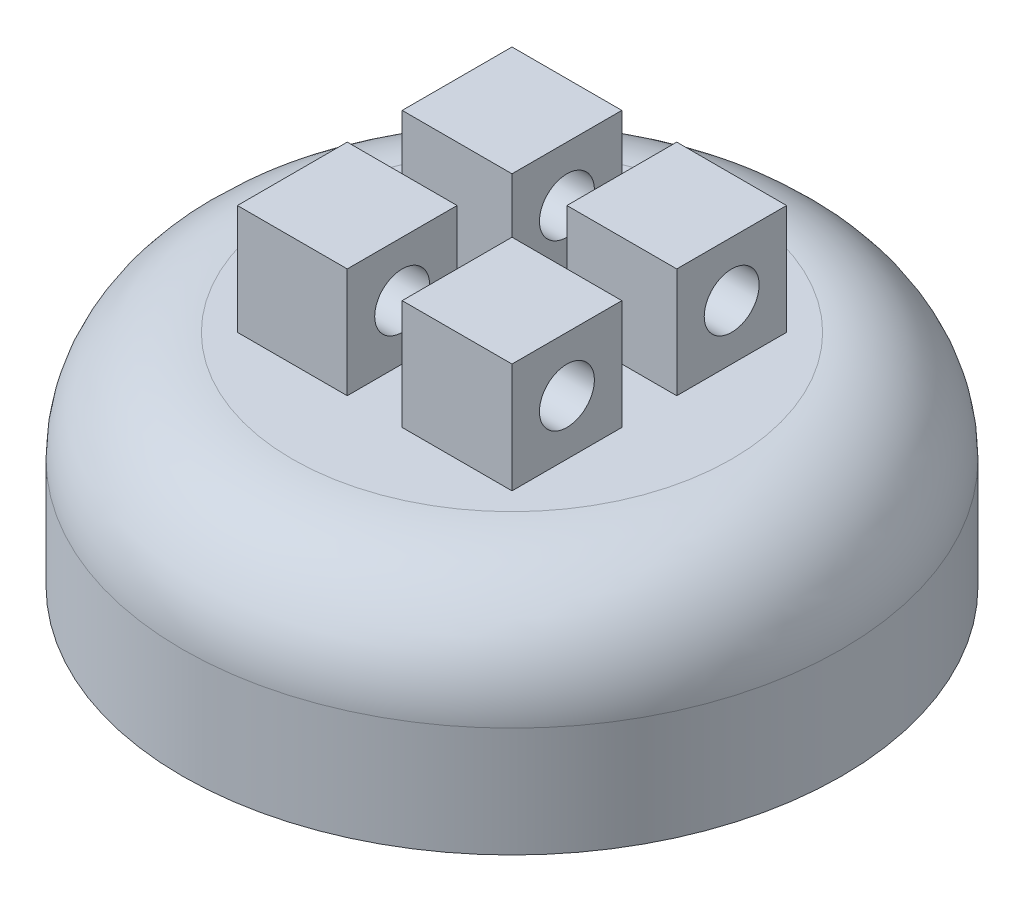
ISO-10303-21;
HEADER;
FILE_DESCRIPTION(('STEP AP214'),'2;1');
FILE_NAME('part.step','',(''),(''),'','','');
FILE_SCHEMA(('AUTOMOTIVE_DESIGN { 1 0 10303 214 1 1 1 1 }'));
ENDSEC;
DATA;
#1=APPLICATION_CONTEXT('core data for automotive mechanical design processes');
#2=APPLICATION_PROTOCOL_DEFINITION('international standard','automotive_design',2000,#1);
#3=PRODUCT_CONTEXT('',#1,'mechanical');
#4=PRODUCT('Part','Part','',(#3));
#5=PRODUCT_RELATED_PRODUCT_CATEGORY('part','',(#4));
#6=PRODUCT_DEFINITION_FORMATION('','',#4);
#7=PRODUCT_DEFINITION_CONTEXT('part definition',#1,'design');
#8=PRODUCT_DEFINITION('design','',#6,#7);
#9=PRODUCT_DEFINITION_SHAPE('','',#8);
#10=(LENGTH_UNIT() NAMED_UNIT(*) SI_UNIT(.MILLI.,.METRE.));
#11=(NAMED_UNIT(*) PLANE_ANGLE_UNIT() SI_UNIT($,.RADIAN.));
#12=(NAMED_UNIT(*) SI_UNIT($,.STERADIAN.) SOLID_ANGLE_UNIT());
#13=UNCERTAINTY_MEASURE_WITH_UNIT(LENGTH_MEASURE(1.E-05),#10,'distance_accuracy_value','');
#14=(GEOMETRIC_REPRESENTATION_CONTEXT(3) GLOBAL_UNCERTAINTY_ASSIGNED_CONTEXT((#13)) GLOBAL_UNIT_ASSIGNED_CONTEXT((#10,
#11,#12)) REPRESENTATION_CONTEXT('',''));
#15=CARTESIAN_POINT('',(0.,0.,0.));
#16=DIRECTION('',(0.,0.,1.));
#17=DIRECTION('',(1.,0.,0.));
#18=AXIS2_PLACEMENT_3D('',#15,#16,#17);
#19=CARTESIAN_POINT('',(0.,50.8,0.));
#20=DIRECTION('',(0.,1.,0.));
#21=DIRECTION('',(0.,0.,1.));
#22=AXIS2_PLACEMENT_3D('',#19,#20,#21);
#23=PLANE('',#22);
#24=CARTESIAN_POINT('',(0.,50.8,0.));
#25=DIRECTION('',(0.,1.,0.));
#26=DIRECTION('',(0.,0.,1.));
#27=AXIS2_PLACEMENT_3D('',#24,#25,#26);
#28=CIRCLE('',#27,50.8);
#29=CARTESIAN_POINT('',(0.,50.8,50.8));
#30=VERTEX_POINT('',#29);
#31=EDGE_CURVE('E55',#30,#30,#28,.T.);
#32=ORIENTED_EDGE('',*,*,#31,.T.);
#33=EDGE_LOOP('',(#32));
#34=FACE_BOUND('',#33,.T.);
#35=DIRECTION('',(0.,0.,1.));
#36=VECTOR('',#35,1.);
#37=CARTESIAN_POINT('',(-31.75,50.8,-31.75));
#38=LINE('',#37,#36);
#39=CARTESIAN_POINT('',(-31.75,50.8,-31.75));
#40=VERTEX_POINT('',#39);
#41=CARTESIAN_POINT('',(-31.75,50.8,-6.35));
#42=VERTEX_POINT('',#41);
#43=EDGE_CURVE('E303',#40,#42,#38,.T.);
#44=ORIENTED_EDGE('',*,*,#43,.F.);
#45=DIRECTION('',(-1.,0.,0.));
#46=VECTOR('',#45,1.);
#47=CARTESIAN_POINT('',(-6.35,50.8,-31.75));
#48=LINE('',#47,#46);
#49=CARTESIAN_POINT('',(-6.35,50.8,-31.75));
#50=VERTEX_POINT('',#49);
#51=EDGE_CURVE('E239',#50,#40,#48,.T.);
#52=ORIENTED_EDGE('',*,*,#51,.F.);
#53=DIRECTION('',(0.,0.,-1.));
#54=VECTOR('',#53,1.);
#55=CARTESIAN_POINT('',(-6.35,50.8,-6.35));
#56=LINE('',#55,#54);
#57=CARTESIAN_POINT('',(-6.35,50.8,-6.35));
#58=VERTEX_POINT('',#57);
#59=EDGE_CURVE('E290',#58,#50,#56,.T.);
#60=ORIENTED_EDGE('',*,*,#59,.F.);
#61=DIRECTION('',(1.,0.,0.));
#62=VECTOR('',#61,1.);
#63=CARTESIAN_POINT('',(-31.75,50.8,-6.35));
#64=LINE('',#63,#62);
#65=EDGE_CURVE('E306',#42,#58,#64,.T.);
#66=ORIENTED_EDGE('',*,*,#65,.F.);
#67=EDGE_LOOP('',(#44,#52,#60,#66));
#68=FACE_BOUND('',#67,.T.);
#69=DIRECTION('',(1.,0.,0.));
#70=VECTOR('',#69,1.);
#71=CARTESIAN_POINT('',(31.75,50.8,31.75));
#72=LINE('',#71,#70);
#73=CARTESIAN_POINT('',(6.35000000000001,50.8,31.75));
#74=VERTEX_POINT('',#73);
#75=CARTESIAN_POINT('',(31.75,50.8,31.75));
#76=VERTEX_POINT('',#75);
#77=EDGE_CURVE('E189',#74,#76,#72,.T.);
#78=ORIENTED_EDGE('',*,*,#77,.F.);
#79=DIRECTION('',(0.,0.,1.));
#80=VECTOR('',#79,1.);
#81=CARTESIAN_POINT('',(6.35000000000001,50.8,31.75));
#82=LINE('',#81,#80);
#83=CARTESIAN_POINT('',(6.35000000000001,50.8,6.35));
#84=VERTEX_POINT('',#83);
#85=EDGE_CURVE('E182',#84,#74,#82,.T.);
#86=ORIENTED_EDGE('',*,*,#85,.F.);
#87=DIRECTION('',(-1.,0.,0.));
#88=VECTOR('',#87,1.);
#89=CARTESIAN_POINT('',(6.35000000000001,50.8,6.35));
#90=LINE('',#89,#88);
#91=CARTESIAN_POINT('',(31.75,50.8,6.35));
#92=VERTEX_POINT('',#91);
#93=EDGE_CURVE('E162',#92,#84,#90,.T.);
#94=ORIENTED_EDGE('',*,*,#93,.F.);
#95=DIRECTION('',(0.,0.,-1.));
#96=VECTOR('',#95,1.);
#97=CARTESIAN_POINT('',(31.75,50.8,6.35));
#98=LINE('',#97,#96);
#99=EDGE_CURVE('E175',#76,#92,#98,.T.);
#100=ORIENTED_EDGE('',*,*,#99,.F.);
#101=EDGE_LOOP('',(#78,#86,#94,#100));
#102=FACE_BOUND('',#101,.T.);
#103=DIRECTION('',(1.,0.,0.));
#104=VECTOR('',#103,1.);
#105=CARTESIAN_POINT('',(-6.35000000000002,50.8,31.75));
#106=LINE('',#105,#104);
#107=CARTESIAN_POINT('',(-31.75,50.8,31.75));
#108=VERTEX_POINT('',#107);
#109=CARTESIAN_POINT('',(-6.35000000000002,50.8,31.75));
#110=VERTEX_POINT('',#109);
#111=EDGE_CURVE('E268',#108,#110,#106,.T.);
#112=ORIENTED_EDGE('',*,*,#111,.F.);
#113=DIRECTION('',(0.,0.,1.));
#114=VECTOR('',#113,1.);
#115=CARTESIAN_POINT('',(-31.75,50.8,31.75));
#116=LINE('',#115,#114);
#117=CARTESIAN_POINT('',(-31.75,50.8,6.35));
#118=VERTEX_POINT('',#117);
#119=EDGE_CURVE('E214',#118,#108,#116,.T.);
#120=ORIENTED_EDGE('',*,*,#119,.F.);
#121=DIRECTION('',(-1.,0.,0.));
#122=VECTOR('',#121,1.);
#123=CARTESIAN_POINT('',(-31.75,50.8,6.35));
#124=LINE('',#123,#122);
#125=CARTESIAN_POINT('',(-6.35000000000002,50.8,6.35));
#126=VERTEX_POINT('',#125);
#127=EDGE_CURVE('E261',#126,#118,#124,.T.);
#128=ORIENTED_EDGE('',*,*,#127,.F.);
#129=DIRECTION('',(0.,0.,-1.));
#130=VECTOR('',#129,1.);
#131=CARTESIAN_POINT('',(-6.35000000000002,50.8,6.35));
#132=LINE('',#131,#130);
#133=EDGE_CURVE('E264',#110,#126,#132,.T.);
#134=ORIENTED_EDGE('',*,*,#133,.F.);
#135=EDGE_LOOP('',(#112,#120,#128,#134));
#136=FACE_BOUND('',#135,.T.);
#137=DIRECTION('',(0.,0.,1.));
#138=VECTOR('',#137,1.);
#139=CARTESIAN_POINT('',(6.34999999999999,50.8,-31.75));
#140=LINE('',#139,#138);
#141=CARTESIAN_POINT('',(6.34999999999999,50.8,-31.75));
#142=VERTEX_POINT('',#141);
#143=CARTESIAN_POINT('',(6.34999999999999,50.8,-6.35));
#144=VERTEX_POINT('',#143);
#145=EDGE_CURVE('E232',#142,#144,#140,.T.);
#146=ORIENTED_EDGE('',*,*,#145,.F.);
#147=DIRECTION('',(-1.,0.,0.));
#148=VECTOR('',#147,1.);
#149=CARTESIAN_POINT('',(31.75,50.8,-31.75));
#150=LINE('',#149,#148);
#151=CARTESIAN_POINT('',(31.75,50.8,-31.75));
#152=VERTEX_POINT('',#151);
#153=EDGE_CURVE('E235',#152,#142,#150,.T.);
#154=ORIENTED_EDGE('',*,*,#153,.F.);
#155=DIRECTION('',(0.,0.,-1.));
#156=VECTOR('',#155,1.);
#157=CARTESIAN_POINT('',(31.75,50.8,-6.35));
#158=LINE('',#157,#156);
#159=CARTESIAN_POINT('',(31.75,50.8,-6.35));
#160=VERTEX_POINT('',#159);
#161=EDGE_CURVE('E225',#160,#152,#158,.T.);
#162=ORIENTED_EDGE('',*,*,#161,.F.);
#163=DIRECTION('',(1.,0.,0.));
#164=VECTOR('',#163,1.);
#165=CARTESIAN_POINT('',(6.34999999999999,50.8,-6.35));
#166=LINE('',#165,#164);
#167=EDGE_CURVE('E228',#144,#160,#166,.T.);
#168=ORIENTED_EDGE('',*,*,#167,.F.);
#169=EDGE_LOOP('',(#146,#154,#162,#168));
#170=FACE_BOUND('',#169,.T.);
#171=ADVANCED_FACE('F45',(#34,#68,#102,#136,#170),#23,.T.);
#172=CARTESIAN_POINT('',(0.,50.8,0.));
#173=DIRECTION('',(0.,-1.,0.));
#174=DIRECTION('',(0.,0.,-1.));
#175=AXIS2_PLACEMENT_3D('',#172,#173,#174);
#176=CYLINDRICAL_SURFACE('',#175,76.2);
#177=CARTESIAN_POINT('',(0.,25.4,0.));
#178=DIRECTION('',(0.,1.,0.));
#179=DIRECTION('',(0.,0.,1.));
#180=AXIS2_PLACEMENT_3D('',#177,#178,#179);
#181=CIRCLE('',#180,76.2);
#182=CARTESIAN_POINT('',(0.,25.4,76.2));
#183=VERTEX_POINT('',#182);
#184=EDGE_CURVE('E11',#183,#183,#181,.F.);
#185=ORIENTED_EDGE('',*,*,#184,.T.);
#186=EDGE_LOOP('',(#185));
#187=FACE_BOUND('',#186,.T.);
#188=CARTESIAN_POINT('',(0.,0.,0.));
#189=DIRECTION('',(0.,1.,0.));
#190=DIRECTION('',(0.,0.,1.));
#191=AXIS2_PLACEMENT_3D('',#188,#189,#190);
#192=CIRCLE('',#191,76.2);
#193=CARTESIAN_POINT('',(0.,0.,76.2));
#194=VERTEX_POINT('',#193);
#195=EDGE_CURVE('E325',#194,#194,#192,.T.);
#196=ORIENTED_EDGE('',*,*,#195,.T.);
#197=EDGE_LOOP('',(#196));
#198=FACE_BOUND('',#197,.T.);
#199=ADVANCED_FACE('F348',(#187,#198),#176,.T.);
#200=CARTESIAN_POINT('',(0.,0.,0.));
#201=DIRECTION('',(0.,1.,0.));
#202=DIRECTION('',(0.,0.,1.));
#203=AXIS2_PLACEMENT_3D('',#200,#201,#202);
#204=PLANE('',#203);
#205=ORIENTED_EDGE('',*,*,#195,.F.);
#206=EDGE_LOOP('',(#205));
#207=FACE_BOUND('',#206,.T.);
#208=ADVANCED_FACE('F337',(#207),#204,.F.);
#209=CARTESIAN_POINT('',(0.,25.4,0.));
#210=DIRECTION('',(0.,1.,0.));
#211=DIRECTION('',(0.,0.,1.));
#212=AXIS2_PLACEMENT_3D('',#209,#210,#211);
#213=TOROIDAL_SURFACE('',#212,50.8,25.4);
#214=ORIENTED_EDGE('',*,*,#184,.F.);
#215=EDGE_LOOP('',(#214));
#216=FACE_BOUND('',#215,.T.);
#217=ORIENTED_EDGE('',*,*,#31,.F.);
#218=EDGE_LOOP('',(#217));
#219=FACE_BOUND('',#218,.T.);
#220=ADVANCED_FACE('F47',(#216,#219),#213,.T.);
#221=CARTESIAN_POINT('',(-6.35,76.2,-31.75));
#222=DIRECTION('',(0.,0.,1.));
#223=DIRECTION('',(1.,0.,0.));
#224=AXIS2_PLACEMENT_3D('',#221,#222,#223);
#225=PLANE('',#224);
#226=ORIENTED_EDGE('',*,*,#51,.T.);
#227=DIRECTION('',(0.,-1.,0.));
#228=VECTOR('',#227,1.);
#229=CARTESIAN_POINT('',(-31.75,76.2,-31.75));
#230=LINE('',#229,#228);
#231=CARTESIAN_POINT('',(-31.75,76.2,-31.75));
#232=VERTEX_POINT('',#231);
#233=EDGE_CURVE('E322',#232,#40,#230,.T.);
#234=ORIENTED_EDGE('',*,*,#233,.F.);
#235=DIRECTION('',(-1.,0.,0.));
#236=VECTOR('',#235,1.);
#237=CARTESIAN_POINT('',(-6.35,76.2,-31.75));
#238=LINE('',#237,#236);
#239=CARTESIAN_POINT('',(-6.35,76.2,-31.75));
#240=VERTEX_POINT('',#239);
#241=EDGE_CURVE('E285',#240,#232,#238,.T.);
#242=ORIENTED_EDGE('',*,*,#241,.F.);
#243=DIRECTION('',(0.,-1.,0.));
#244=VECTOR('',#243,1.);
#245=CARTESIAN_POINT('',(-6.35,76.2,-31.75));
#246=LINE('',#245,#244);
#247=EDGE_CURVE('E299',#240,#50,#246,.T.);
#248=ORIENTED_EDGE('',*,*,#247,.T.);
#249=EDGE_LOOP('',(#226,#234,#242,#248));
#250=FACE_BOUND('',#249,.T.);
#251=ADVANCED_FACE('F336',(#250),#225,.F.);
#252=CARTESIAN_POINT('',(-31.75,76.2,-31.75));
#253=DIRECTION('',(1.,0.,0.));
#254=DIRECTION('',(0.,0.,-1.));
#255=AXIS2_PLACEMENT_3D('',#252,#253,#254);
#256=PLANE('',#255);
#257=CARTESIAN_POINT('',(-31.75,63.5,-19.05));
#258=DIRECTION('',(-1.,0.,0.));
#259=DIRECTION('',(0.,0.,1.));
#260=AXIS2_PLACEMENT_3D('',#257,#258,#259);
#261=CIRCLE('',#260,6.35);
#262=CARTESIAN_POINT('',(-31.75,63.5,-12.7));
#263=VERTEX_POINT('',#262);
#264=EDGE_CURVE('E449',#263,#263,#261,.T.);
#265=ORIENTED_EDGE('',*,*,#264,.F.);
#266=EDGE_LOOP('',(#265));
#267=FACE_BOUND('',#266,.T.);
#268=ORIENTED_EDGE('',*,*,#43,.T.);
#269=DIRECTION('',(0.,-1.,0.));
#270=VECTOR('',#269,1.);
#271=CARTESIAN_POINT('',(-31.75,76.2,-6.35));
#272=LINE('',#271,#270);
#273=CARTESIAN_POINT('',(-31.75,76.2,-6.35));
#274=VERTEX_POINT('',#273);
#275=EDGE_CURVE('E318',#274,#42,#272,.T.);
#276=ORIENTED_EDGE('',*,*,#275,.F.);
#277=DIRECTION('',(0.,0.,1.));
#278=VECTOR('',#277,1.);
#279=CARTESIAN_POINT('',(-31.75,76.2,-31.75));
#280=LINE('',#279,#278);
#281=EDGE_CURVE('E289',#232,#274,#280,.T.);
#282=ORIENTED_EDGE('',*,*,#281,.F.);
#283=ORIENTED_EDGE('',*,*,#233,.T.);
#284=EDGE_LOOP('',(#268,#276,#282,#283));
#285=FACE_BOUND('',#284,.T.);
#286=ADVANCED_FACE('F344',(#267,#285),#256,.F.);
#287=CARTESIAN_POINT('',(-31.75,76.2,-6.35));
#288=DIRECTION('',(0.,0.,-1.));
#289=DIRECTION('',(-1.,0.,0.));
#290=AXIS2_PLACEMENT_3D('',#287,#288,#289);
#291=PLANE('',#290);
#292=ORIENTED_EDGE('',*,*,#65,.T.);
#293=DIRECTION('',(0.,-1.,0.));
#294=VECTOR('',#293,1.);
#295=CARTESIAN_POINT('',(-6.35,76.2,-6.35));
#296=LINE('',#295,#294);
#297=CARTESIAN_POINT('',(-6.35,76.2,-6.35));
#298=VERTEX_POINT('',#297);
#299=EDGE_CURVE('E315',#298,#58,#296,.T.);
#300=ORIENTED_EDGE('',*,*,#299,.F.);
#301=DIRECTION('',(1.,0.,0.));
#302=VECTOR('',#301,1.);
#303=CARTESIAN_POINT('',(-31.75,76.2,-6.35));
#304=LINE('',#303,#302);
#305=EDGE_CURVE('E293',#274,#298,#304,.T.);
#306=ORIENTED_EDGE('',*,*,#305,.F.);
#307=ORIENTED_EDGE('',*,*,#275,.T.);
#308=EDGE_LOOP('',(#292,#300,#306,#307));
#309=FACE_BOUND('',#308,.T.);
#310=ADVANCED_FACE('F359',(#309),#291,.F.);
#311=CARTESIAN_POINT('',(-6.35,76.2,-6.35));
#312=DIRECTION('',(-1.,0.,0.));
#313=DIRECTION('',(0.,0.,1.));
#314=AXIS2_PLACEMENT_3D('',#311,#312,#313);
#315=PLANE('',#314);
#316=CARTESIAN_POINT('',(-6.35,63.5,-19.05));
#317=DIRECTION('',(-1.,0.,0.));
#318=DIRECTION('',(0.,0.,1.));
#319=AXIS2_PLACEMENT_3D('',#316,#317,#318);
#320=CIRCLE('',#319,6.35);
#321=CARTESIAN_POINT('',(-6.35,63.5,-12.7));
#322=VERTEX_POINT('',#321);
#323=EDGE_CURVE('E467',#322,#322,#320,.T.);
#324=ORIENTED_EDGE('',*,*,#323,.T.);
#325=EDGE_LOOP('',(#324));
#326=FACE_BOUND('',#325,.T.);
#327=ORIENTED_EDGE('',*,*,#59,.T.);
#328=ORIENTED_EDGE('',*,*,#247,.F.);
#329=DIRECTION('',(0.,0.,-1.));
#330=VECTOR('',#329,1.);
#331=CARTESIAN_POINT('',(-6.35,76.2,-6.35));
#332=LINE('',#331,#330);
#333=EDGE_CURVE('E296',#298,#240,#332,.T.);
#334=ORIENTED_EDGE('',*,*,#333,.F.);
#335=ORIENTED_EDGE('',*,*,#299,.T.);
#336=EDGE_LOOP('',(#327,#328,#334,#335));
#337=FACE_BOUND('',#336,.T.);
#338=ADVANCED_FACE('F363',(#326,#337),#315,.F.);
#339=CARTESIAN_POINT('',(0.,76.2,0.));
#340=DIRECTION('',(0.,1.,0.));
#341=DIRECTION('',(0.,0.,1.));
#342=AXIS2_PLACEMENT_3D('',#339,#340,#341);
#343=PLANE('',#342);
#344=ORIENTED_EDGE('',*,*,#241,.T.);
#345=ORIENTED_EDGE('',*,*,#281,.T.);
#346=ORIENTED_EDGE('',*,*,#305,.T.);
#347=ORIENTED_EDGE('',*,*,#333,.T.);
#348=EDGE_LOOP('',(#344,#345,#346,#347));
#349=FACE_BOUND('',#348,.T.);
#350=ADVANCED_FACE('F367',(#349),#343,.T.);
#351=CARTESIAN_POINT('',(6.35000000000001,76.2,31.75));
#352=DIRECTION('',(1.,0.,0.));
#353=DIRECTION('',(0.,0.,-1.));
#354=AXIS2_PLACEMENT_3D('',#351,#352,#353);
#355=PLANE('',#354);
#356=CARTESIAN_POINT('',(6.35000000000001,63.5,19.05));
#357=DIRECTION('',(1.,0.,0.));
#358=DIRECTION('',(0.,0.,-1.));
#359=AXIS2_PLACEMENT_3D('',#356,#357,#358);
#360=CIRCLE('',#359,6.35);
#361=CARTESIAN_POINT('',(6.35000000000001,63.5,12.7));
#362=VERTEX_POINT('',#361);
#363=EDGE_CURVE('E447',#362,#362,#360,.T.);
#364=ORIENTED_EDGE('',*,*,#363,.T.);
#365=EDGE_LOOP('',(#364));
#366=FACE_BOUND('',#365,.T.);
#367=ORIENTED_EDGE('',*,*,#85,.T.);
#368=DIRECTION('',(0.,-1.,0.));
#369=VECTOR('',#368,1.);
#370=CARTESIAN_POINT('',(6.35000000000001,76.2,31.75));
#371=LINE('',#370,#369);
#372=CARTESIAN_POINT('',(6.35000000000001,76.2,31.75));
#373=VERTEX_POINT('',#372);
#374=EDGE_CURVE('E471',#373,#74,#371,.T.);
#375=ORIENTED_EDGE('',*,*,#374,.F.);
#376=DIRECTION('',(0.,0.,1.));
#377=VECTOR('',#376,1.);
#378=CARTESIAN_POINT('',(6.35000000000001,76.2,31.75));
#379=LINE('',#378,#377);
#380=CARTESIAN_POINT('',(6.35000000000001,76.2,6.35));
#381=VERTEX_POINT('',#380);
#382=EDGE_CURVE('E176',#381,#373,#379,.T.);
#383=ORIENTED_EDGE('',*,*,#382,.F.);
#384=DIRECTION('',(0.,-1.,0.));
#385=VECTOR('',#384,1.);
#386=CARTESIAN_POINT('',(6.35000000000001,76.2,6.35));
#387=LINE('',#386,#385);
#388=EDGE_CURVE('E166',#381,#84,#387,.T.);
#389=ORIENTED_EDGE('',*,*,#388,.T.);
#390=EDGE_LOOP('',(#367,#375,#383,#389));
#391=FACE_BOUND('',#390,.T.);
#392=ADVANCED_FACE('F180',(#366,#391),#355,.F.);
#393=CARTESIAN_POINT('',(31.75,76.2,31.75));
#394=DIRECTION('',(0.,0.,-1.));
#395=DIRECTION('',(-1.,0.,0.));
#396=AXIS2_PLACEMENT_3D('',#393,#394,#395);
#397=PLANE('',#396);
#398=ORIENTED_EDGE('',*,*,#77,.T.);
#399=DIRECTION('',(0.,-1.,0.));
#400=VECTOR('',#399,1.);
#401=CARTESIAN_POINT('',(31.75,76.2,31.75));
#402=LINE('',#401,#400);
#403=CARTESIAN_POINT('',(31.75,76.2,31.75));
#404=VERTEX_POINT('',#403);
#405=EDGE_CURVE('E474',#404,#76,#402,.T.);
#406=ORIENTED_EDGE('',*,*,#405,.F.);
#407=DIRECTION('',(1.,0.,0.));
#408=VECTOR('',#407,1.);
#409=CARTESIAN_POINT('',(31.75,76.2,31.75));
#410=LINE('',#409,#408);
#411=EDGE_CURVE('E205',#373,#404,#410,.T.);
#412=ORIENTED_EDGE('',*,*,#411,.F.);
#413=ORIENTED_EDGE('',*,*,#374,.T.);
#414=EDGE_LOOP('',(#398,#406,#412,#413));
#415=FACE_BOUND('',#414,.T.);
#416=ADVANCED_FACE('F421',(#415),#397,.F.);
#417=CARTESIAN_POINT('',(31.75,76.2,6.35));
#418=DIRECTION('',(-1.,0.,0.));
#419=DIRECTION('',(0.,0.,1.));
#420=AXIS2_PLACEMENT_3D('',#417,#418,#419);
#421=PLANE('',#420);
#422=CARTESIAN_POINT('',(31.75,63.5,19.05));
#423=DIRECTION('',(-1.,0.,0.));
#424=DIRECTION('',(0.,0.,1.));
#425=AXIS2_PLACEMENT_3D('',#422,#423,#424);
#426=CIRCLE('',#425,6.35);
#427=CARTESIAN_POINT('',(31.75,63.5,25.4));
#428=VERTEX_POINT('',#427);
#429=EDGE_CURVE('E444',#428,#428,#426,.F.);
#430=ORIENTED_EDGE('',*,*,#429,.F.);
#431=EDGE_LOOP('',(#430));
#432=FACE_BOUND('',#431,.T.);
#433=ORIENTED_EDGE('',*,*,#99,.T.);
#434=DIRECTION('',(0.,-1.,0.));
#435=VECTOR('',#434,1.);
#436=CARTESIAN_POINT('',(31.75,76.2,6.35));
#437=LINE('',#436,#435);
#438=CARTESIAN_POINT('',(31.75,76.2,6.35));
#439=VERTEX_POINT('',#438);
#440=EDGE_CURVE('E169',#439,#92,#437,.T.);
#441=ORIENTED_EDGE('',*,*,#440,.F.);
#442=DIRECTION('',(0.,0.,-1.));
#443=VECTOR('',#442,1.);
#444=CARTESIAN_POINT('',(31.75,76.2,6.35));
#445=LINE('',#444,#443);
#446=EDGE_CURVE('E202',#404,#439,#445,.T.);
#447=ORIENTED_EDGE('',*,*,#446,.F.);
#448=ORIENTED_EDGE('',*,*,#405,.T.);
#449=EDGE_LOOP('',(#433,#441,#447,#448));
#450=FACE_BOUND('',#449,.T.);
#451=ADVANCED_FACE('F418',(#432,#450),#421,.F.);
#452=CARTESIAN_POINT('',(6.35000000000001,76.2,6.35));
#453=DIRECTION('',(0.,0.,1.));
#454=DIRECTION('',(1.,0.,0.));
#455=AXIS2_PLACEMENT_3D('',#452,#453,#454);
#456=PLANE('',#455);
#457=ORIENTED_EDGE('',*,*,#93,.T.);
#458=ORIENTED_EDGE('',*,*,#388,.F.);
#459=DIRECTION('',(-1.,0.,0.));
#460=VECTOR('',#459,1.);
#461=CARTESIAN_POINT('',(6.35000000000001,76.2,6.35));
#462=LINE('',#461,#460);
#463=EDGE_CURVE('E186',#439,#381,#462,.T.);
#464=ORIENTED_EDGE('',*,*,#463,.F.);
#465=ORIENTED_EDGE('',*,*,#440,.T.);
#466=EDGE_LOOP('',(#457,#458,#464,#465));
#467=FACE_BOUND('',#466,.T.);
#468=ADVANCED_FACE('F164',(#467),#456,.F.);
#469=CARTESIAN_POINT('',(0.,76.2,0.));
#470=DIRECTION('',(0.,-1.,0.));
#471=DIRECTION('',(0.,0.,-1.));
#472=AXIS2_PLACEMENT_3D('',#469,#470,#471);
#473=PLANE('',#472);
#474=ORIENTED_EDGE('',*,*,#382,.T.);
#475=ORIENTED_EDGE('',*,*,#411,.T.);
#476=ORIENTED_EDGE('',*,*,#446,.T.);
#477=ORIENTED_EDGE('',*,*,#463,.T.);
#478=EDGE_LOOP('',(#474,#475,#476,#477));
#479=FACE_BOUND('',#478,.T.);
#480=ADVANCED_FACE('F391',(#479),#473,.F.);
#481=CARTESIAN_POINT('',(-31.75,76.2,31.75));
#482=DIRECTION('',(1.,0.,0.));
#483=DIRECTION('',(0.,0.,-1.));
#484=AXIS2_PLACEMENT_3D('',#481,#482,#483);
#485=PLANE('',#484);
#486=CARTESIAN_POINT('',(-31.75,63.5,19.05));
#487=DIRECTION('',(-1.,0.,0.));
#488=DIRECTION('',(0.,0.,1.));
#489=AXIS2_PLACEMENT_3D('',#486,#487,#488);
#490=CIRCLE('',#489,6.35);
#491=CARTESIAN_POINT('',(-31.75,63.5,25.4));
#492=VERTEX_POINT('',#491);
#493=EDGE_CURVE('E677',#492,#492,#490,.T.);
#494=ORIENTED_EDGE('',*,*,#493,.F.);
#495=EDGE_LOOP('',(#494));
#496=FACE_BOUND('',#495,.T.);
#497=ORIENTED_EDGE('',*,*,#119,.T.);
#498=DIRECTION('',(0.,-1.,0.));
#499=VECTOR('',#498,1.);
#500=CARTESIAN_POINT('',(-31.75,76.2,31.75));
#501=LINE('',#500,#499);
#502=CARTESIAN_POINT('',(-31.75,76.2,31.75));
#503=VERTEX_POINT('',#502);
#504=EDGE_CURVE('E191',#503,#108,#501,.T.);
#505=ORIENTED_EDGE('',*,*,#504,.F.);
#506=DIRECTION('',(0.,0.,1.));
#507=VECTOR('',#506,1.);
#508=CARTESIAN_POINT('',(-31.75,76.2,31.75));
#509=LINE('',#508,#507);
#510=CARTESIAN_POINT('',(-31.75,76.2,6.35));
#511=VERTEX_POINT('',#510);
#512=EDGE_CURVE('E265',#511,#503,#509,.T.);
#513=ORIENTED_EDGE('',*,*,#512,.F.);
#514=DIRECTION('',(0.,-1.,0.));
#515=VECTOR('',#514,1.);
#516=CARTESIAN_POINT('',(-31.75,76.2,6.35));
#517=LINE('',#516,#515);
#518=EDGE_CURVE('E256',#511,#118,#517,.T.);
#519=ORIENTED_EDGE('',*,*,#518,.T.);
#520=EDGE_LOOP('',(#497,#505,#513,#519));
#521=FACE_BOUND('',#520,.T.);
#522=ADVANCED_FACE('F387',(#496,#521),#485,.F.);
#523=CARTESIAN_POINT('',(-6.35000000000002,76.2,31.75));
#524=DIRECTION('',(0.,0.,-1.));
#525=DIRECTION('',(-1.,0.,0.));
#526=AXIS2_PLACEMENT_3D('',#523,#524,#525);
#527=PLANE('',#526);
#528=ORIENTED_EDGE('',*,*,#111,.T.);
#529=DIRECTION('',(0.,-1.,0.));
#530=VECTOR('',#529,1.);
#531=CARTESIAN_POINT('',(-6.35000000000002,76.2,31.75));
#532=LINE('',#531,#530);
#533=CARTESIAN_POINT('',(-6.35000000000002,76.2,31.75));
#534=VERTEX_POINT('',#533);
#535=EDGE_CURVE('E195',#534,#110,#532,.T.);
#536=ORIENTED_EDGE('',*,*,#535,.F.);
#537=DIRECTION('',(1.,0.,0.));
#538=VECTOR('',#537,1.);
#539=CARTESIAN_POINT('',(-6.35000000000002,76.2,31.75));
#540=LINE('',#539,#538);
#541=EDGE_CURVE('E279',#503,#534,#540,.T.);
#542=ORIENTED_EDGE('',*,*,#541,.F.);
#543=ORIENTED_EDGE('',*,*,#504,.T.);
#544=EDGE_LOOP('',(#528,#536,#542,#543));
#545=FACE_BOUND('',#544,.T.);
#546=ADVANCED_FACE('F383',(#545),#527,.F.);
#547=CARTESIAN_POINT('',(-6.35000000000002,76.2,6.35));
#548=DIRECTION('',(-1.,0.,0.));
#549=DIRECTION('',(0.,0.,1.));
#550=AXIS2_PLACEMENT_3D('',#547,#548,#549);
#551=PLANE('',#550);
#552=CARTESIAN_POINT('',(-6.35000000000002,63.5,19.05));
#553=DIRECTION('',(-1.,0.,0.));
#554=DIRECTION('',(0.,0.,1.));
#555=AXIS2_PLACEMENT_3D('',#552,#553,#554);
#556=CIRCLE('',#555,6.35);
#557=CARTESIAN_POINT('',(-6.35000000000002,63.5,25.4));
#558=VERTEX_POINT('',#557);
#559=EDGE_CURVE('E49',#558,#558,#556,.T.);
#560=ORIENTED_EDGE('',*,*,#559,.T.);
#561=EDGE_LOOP('',(#560));
#562=FACE_BOUND('',#561,.T.);
#563=ORIENTED_EDGE('',*,*,#133,.T.);
#564=DIRECTION('',(0.,-1.,0.));
#565=VECTOR('',#564,1.);
#566=CARTESIAN_POINT('',(-6.35000000000002,76.2,6.35));
#567=LINE('',#566,#565);
#568=CARTESIAN_POINT('',(-6.35000000000002,76.2,6.35));
#569=VERTEX_POINT('',#568);
#570=EDGE_CURVE('E70',#569,#126,#567,.T.);
#571=ORIENTED_EDGE('',*,*,#570,.F.);
#572=DIRECTION('',(0.,0.,-1.));
#573=VECTOR('',#572,1.);
#574=CARTESIAN_POINT('',(-6.35000000000002,76.2,6.35));
#575=LINE('',#574,#573);
#576=EDGE_CURVE('E276',#534,#569,#575,.T.);
#577=ORIENTED_EDGE('',*,*,#576,.F.);
#578=ORIENTED_EDGE('',*,*,#535,.T.);
#579=EDGE_LOOP('',(#563,#571,#577,#578));
#580=FACE_BOUND('',#579,.T.);
#581=ADVANCED_FACE('F380',(#562,#580),#551,.F.);
#582=CARTESIAN_POINT('',(-31.75,76.2,6.35));
#583=DIRECTION('',(0.,0.,1.));
#584=DIRECTION('',(1.,0.,0.));
#585=AXIS2_PLACEMENT_3D('',#582,#583,#584);
#586=PLANE('',#585);
#587=ORIENTED_EDGE('',*,*,#127,.T.);
#588=ORIENTED_EDGE('',*,*,#518,.F.);
#589=DIRECTION('',(-1.,0.,0.));
#590=VECTOR('',#589,1.);
#591=CARTESIAN_POINT('',(-31.75,76.2,6.35));
#592=LINE('',#591,#590);
#593=EDGE_CURVE('E260',#569,#511,#592,.T.);
#594=ORIENTED_EDGE('',*,*,#593,.F.);
#595=ORIENTED_EDGE('',*,*,#570,.T.);
#596=EDGE_LOOP('',(#587,#588,#594,#595));
#597=FACE_BOUND('',#596,.T.);
#598=ADVANCED_FACE('F376',(#597),#586,.F.);
#599=CARTESIAN_POINT('',(0.,76.2,0.));
#600=DIRECTION('',(0.,-1.,0.));
#601=DIRECTION('',(0.,0.,-1.));
#602=AXIS2_PLACEMENT_3D('',#599,#600,#601);
#603=PLANE('',#602);
#604=ORIENTED_EDGE('',*,*,#512,.T.);
#605=ORIENTED_EDGE('',*,*,#541,.T.);
#606=ORIENTED_EDGE('',*,*,#576,.T.);
#607=ORIENTED_EDGE('',*,*,#593,.T.);
#608=EDGE_LOOP('',(#604,#605,#606,#607));
#609=FACE_BOUND('',#608,.T.);
#610=ADVANCED_FACE('F372',(#609),#603,.F.);
#611=CARTESIAN_POINT('',(31.75,76.2,-31.75));
#612=DIRECTION('',(0.,0.,1.));
#613=DIRECTION('',(1.,0.,0.));
#614=AXIS2_PLACEMENT_3D('',#611,#612,#613);
#615=PLANE('',#614);
#616=ORIENTED_EDGE('',*,*,#153,.T.);
#617=DIRECTION('',(0.,-1.,0.));
#618=VECTOR('',#617,1.);
#619=CARTESIAN_POINT('',(6.34999999999999,76.2,-31.75));
#620=LINE('',#619,#618);
#621=CARTESIAN_POINT('',(6.34999999999999,76.2,-31.75));
#622=VERTEX_POINT('',#621);
#623=EDGE_CURVE('E210',#622,#142,#620,.T.);
#624=ORIENTED_EDGE('',*,*,#623,.F.);
#625=DIRECTION('',(-1.,0.,0.));
#626=VECTOR('',#625,1.);
#627=CARTESIAN_POINT('',(31.75,76.2,-31.75));
#628=LINE('',#627,#626);
#629=CARTESIAN_POINT('',(31.75,76.2,-31.75));
#630=VERTEX_POINT('',#629);
#631=EDGE_CURVE('E229',#630,#622,#628,.T.);
#632=ORIENTED_EDGE('',*,*,#631,.F.);
#633=DIRECTION('',(0.,-1.,0.));
#634=VECTOR('',#633,1.);
#635=CARTESIAN_POINT('',(31.75,76.2,-31.75));
#636=LINE('',#635,#634);
#637=EDGE_CURVE('E220',#630,#152,#636,.T.);
#638=ORIENTED_EDGE('',*,*,#637,.T.);
#639=EDGE_LOOP('',(#616,#624,#632,#638));
#640=FACE_BOUND('',#639,.T.);
#641=ADVANCED_FACE('F375',(#640),#615,.F.);
#642=CARTESIAN_POINT('',(6.34999999999999,76.2,-31.75));
#643=DIRECTION('',(1.,0.,0.));
#644=DIRECTION('',(0.,0.,-1.));
#645=AXIS2_PLACEMENT_3D('',#642,#643,#644);
#646=PLANE('',#645);
#647=CARTESIAN_POINT('',(6.34999999999999,63.5,-19.05));
#648=DIRECTION('',(1.,0.,0.));
#649=DIRECTION('',(0.,0.,-1.));
#650=AXIS2_PLACEMENT_3D('',#647,#648,#649);
#651=CIRCLE('',#650,6.35);
#652=CARTESIAN_POINT('',(6.34999999999999,63.5,-25.4));
#653=VERTEX_POINT('',#652);
#654=EDGE_CURVE('E463',#653,#653,#651,.T.);
#655=ORIENTED_EDGE('',*,*,#654,.T.);
#656=EDGE_LOOP('',(#655));
#657=FACE_BOUND('',#656,.T.);
#658=ORIENTED_EDGE('',*,*,#145,.T.);
#659=DIRECTION('',(0.,-1.,0.));
#660=VECTOR('',#659,1.);
#661=CARTESIAN_POINT('',(6.34999999999999,76.2,-6.35));
#662=LINE('',#661,#660);
#663=CARTESIAN_POINT('',(6.34999999999999,76.2,-6.35));
#664=VERTEX_POINT('',#663);
#665=EDGE_CURVE('E213',#664,#144,#662,.T.);
#666=ORIENTED_EDGE('',*,*,#665,.F.);
#667=DIRECTION('',(0.,0.,1.));
#668=VECTOR('',#667,1.);
#669=CARTESIAN_POINT('',(6.34999999999999,76.2,-31.75));
#670=LINE('',#669,#668);
#671=EDGE_CURVE('E245',#622,#664,#670,.T.);
#672=ORIENTED_EDGE('',*,*,#671,.F.);
#673=ORIENTED_EDGE('',*,*,#623,.T.);
#674=EDGE_LOOP('',(#658,#666,#672,#673));
#675=FACE_BOUND('',#674,.T.);
#676=ADVANCED_FACE('F405',(#657,#675),#646,.F.);
#677=CARTESIAN_POINT('',(6.34999999999999,76.2,-6.35));
#678=DIRECTION('',(0.,0.,-1.));
#679=DIRECTION('',(-1.,0.,0.));
#680=AXIS2_PLACEMENT_3D('',#677,#678,#679);
#681=PLANE('',#680);
#682=ORIENTED_EDGE('',*,*,#167,.T.);
#683=DIRECTION('',(0.,-1.,0.));
#684=VECTOR('',#683,1.);
#685=CARTESIAN_POINT('',(31.75,76.2,-6.35));
#686=LINE('',#685,#684);
#687=CARTESIAN_POINT('',(31.75,76.2,-6.35));
#688=VERTEX_POINT('',#687);
#689=EDGE_CURVE('E62',#688,#160,#686,.T.);
#690=ORIENTED_EDGE('',*,*,#689,.F.);
#691=DIRECTION('',(1.,0.,0.));
#692=VECTOR('',#691,1.);
#693=CARTESIAN_POINT('',(6.34999999999999,76.2,-6.35));
#694=LINE('',#693,#692);
#695=EDGE_CURVE('E242',#664,#688,#694,.T.);
#696=ORIENTED_EDGE('',*,*,#695,.F.);
#697=ORIENTED_EDGE('',*,*,#665,.T.);
#698=EDGE_LOOP('',(#682,#690,#696,#697));
#699=FACE_BOUND('',#698,.T.);
#700=ADVANCED_FACE('F401',(#699),#681,.F.);
#701=CARTESIAN_POINT('',(31.75,76.2,-6.35));
#702=DIRECTION('',(-1.,0.,0.));
#703=DIRECTION('',(0.,0.,1.));
#704=AXIS2_PLACEMENT_3D('',#701,#702,#703);
#705=PLANE('',#704);
#706=CARTESIAN_POINT('',(31.75,63.5,-19.05));
#707=DIRECTION('',(-1.,0.,0.));
#708=DIRECTION('',(0.,0.,1.));
#709=AXIS2_PLACEMENT_3D('',#706,#707,#708);
#710=CIRCLE('',#709,6.35);
#711=CARTESIAN_POINT('',(31.75,63.5,-12.7));
#712=VERTEX_POINT('',#711);
#713=EDGE_CURVE('E454',#712,#712,#710,.F.);
#714=ORIENTED_EDGE('',*,*,#713,.F.);
#715=EDGE_LOOP('',(#714));
#716=FACE_BOUND('',#715,.T.);
#717=ORIENTED_EDGE('',*,*,#161,.T.);
#718=ORIENTED_EDGE('',*,*,#637,.F.);
#719=DIRECTION('',(0.,0.,-1.));
#720=VECTOR('',#719,1.);
#721=CARTESIAN_POINT('',(31.75,76.2,-6.35));
#722=LINE('',#721,#720);
#723=EDGE_CURVE('E224',#688,#630,#722,.T.);
#724=ORIENTED_EDGE('',*,*,#723,.F.);
#725=ORIENTED_EDGE('',*,*,#689,.T.);
#726=EDGE_LOOP('',(#717,#718,#724,#725));
#727=FACE_BOUND('',#726,.T.);
#728=ADVANCED_FACE('F397',(#716,#727),#705,.F.);
#729=CARTESIAN_POINT('',(0.,76.2,0.));
#730=DIRECTION('',(0.,1.,0.));
#731=DIRECTION('',(0.,0.,1.));
#732=AXIS2_PLACEMENT_3D('',#729,#730,#731);
#733=PLANE('',#732);
#734=ORIENTED_EDGE('',*,*,#631,.T.);
#735=ORIENTED_EDGE('',*,*,#671,.T.);
#736=ORIENTED_EDGE('',*,*,#695,.T.);
#737=ORIENTED_EDGE('',*,*,#723,.T.);
#738=EDGE_LOOP('',(#734,#735,#736,#737));
#739=FACE_BOUND('',#738,.T.);
#740=ADVANCED_FACE('F393',(#739),#733,.T.);
#741=CARTESIAN_POINT('',(49.7105122421383,63.5,-19.05));
#742=DIRECTION('',(-1.,0.,0.));
#743=DIRECTION('',(0.,0.,1.));
#744=AXIS2_PLACEMENT_3D('',#741,#742,#743);
#745=CYLINDRICAL_SURFACE('',#744,6.35);
#746=ORIENTED_EDGE('',*,*,#713,.T.);
#747=EDGE_LOOP('',(#746));
#748=FACE_BOUND('',#747,.T.);
#749=ORIENTED_EDGE('',*,*,#654,.F.);
#750=EDGE_LOOP('',(#749));
#751=FACE_BOUND('',#750,.T.);
#752=ADVANCED_FACE('F396',(#748,#751),#745,.F.);
#753=ORIENTED_EDGE('',*,*,#264,.T.);
#754=EDGE_LOOP('',(#753));
#755=FACE_BOUND('',#754,.T.);
#756=ORIENTED_EDGE('',*,*,#323,.F.);
#757=EDGE_LOOP('',(#756));
#758=FACE_BOUND('',#757,.T.);
#759=ADVANCED_FACE('F429',(#755,#758),#745,.F.);
#760=CARTESIAN_POINT('',(49.7105122421383,63.5,19.05));
#761=DIRECTION('',(-1.,0.,0.));
#762=DIRECTION('',(0.,0.,1.));
#763=AXIS2_PLACEMENT_3D('',#760,#761,#762);
#764=CYLINDRICAL_SURFACE('',#763,6.35);
#765=ORIENTED_EDGE('',*,*,#493,.T.);
#766=EDGE_LOOP('',(#765));
#767=FACE_BOUND('',#766,.T.);
#768=ORIENTED_EDGE('',*,*,#559,.F.);
#769=EDGE_LOOP('',(#768));
#770=FACE_BOUND('',#769,.T.);
#771=ADVANCED_FACE('F432',(#767,#770),#764,.F.);
#772=ORIENTED_EDGE('',*,*,#429,.T.);
#773=EDGE_LOOP('',(#772));
#774=FACE_BOUND('',#773,.T.);
#775=ORIENTED_EDGE('',*,*,#363,.F.);
#776=EDGE_LOOP('',(#775));
#777=FACE_BOUND('',#776,.T.);
#778=ADVANCED_FACE('F434',(#774,#777),#764,.F.);
#779=CLOSED_SHELL('',(#171,#199,#208,#220,#251,#286,#310,#338,#350,#392,#416,#451,#468,#480,
#522,#546,#581,#598,#610,#641,#676,#700,#728,#740,#752,#759,#771,#778));
#780=MANIFOLD_SOLID_BREP('B2',#779);
#781=ADVANCED_BREP_SHAPE_REPRESENTATION('',(#18,#780),#14);
#782=SHAPE_DEFINITION_REPRESENTATION(#9,#781);
ENDSEC;
END-ISO-10303-21;
